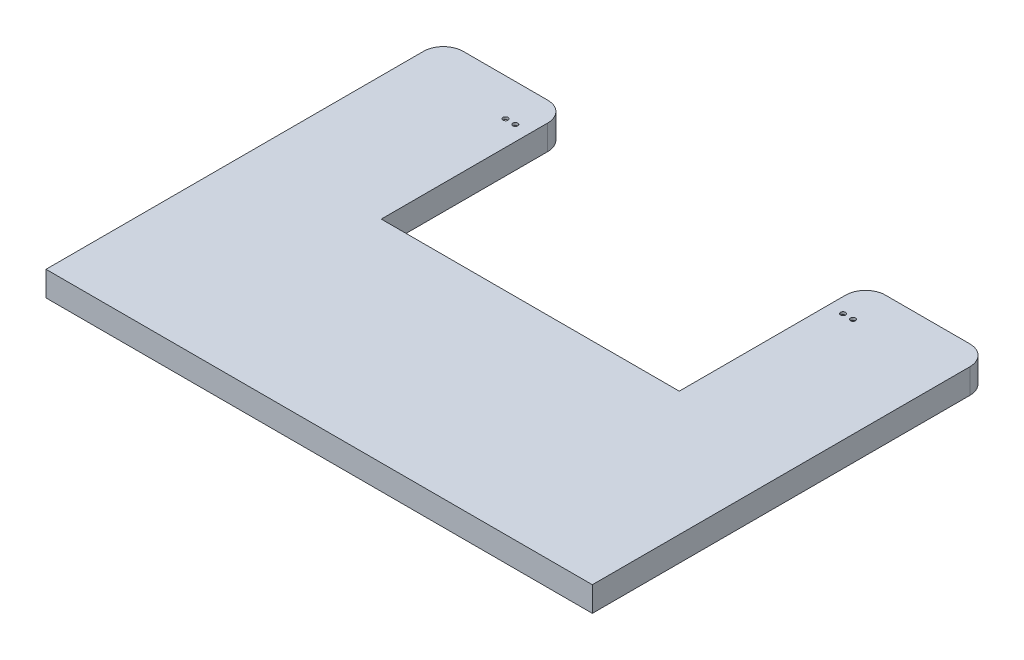
ISO-10303-21;
HEADER;
FILE_DESCRIPTION(('STEP AP214'),'2;1');
FILE_NAME('part.step','',(''),(''),'','','');
FILE_SCHEMA(('AUTOMOTIVE_DESIGN { 1 0 10303 214 1 1 1 1 }'));
ENDSEC;
DATA;
#1=APPLICATION_CONTEXT('core data for automotive mechanical design processes');
#2=APPLICATION_PROTOCOL_DEFINITION('international standard','automotive_design',2000,#1);
#3=PRODUCT_CONTEXT('',#1,'mechanical');
#4=PRODUCT('Part','Part','',(#3));
#5=PRODUCT_RELATED_PRODUCT_CATEGORY('part','',(#4));
#6=PRODUCT_DEFINITION_FORMATION('','',#4);
#7=PRODUCT_DEFINITION_CONTEXT('part definition',#1,'design');
#8=PRODUCT_DEFINITION('design','',#6,#7);
#9=PRODUCT_DEFINITION_SHAPE('','',#8);
#10=(LENGTH_UNIT() NAMED_UNIT(*) SI_UNIT(.MILLI.,.METRE.));
#11=(NAMED_UNIT(*) PLANE_ANGLE_UNIT() SI_UNIT($,.RADIAN.));
#12=(NAMED_UNIT(*) SI_UNIT($,.STERADIAN.) SOLID_ANGLE_UNIT());
#13=UNCERTAINTY_MEASURE_WITH_UNIT(LENGTH_MEASURE(1.E-05),#10,'distance_accuracy_value','');
#14=(GEOMETRIC_REPRESENTATION_CONTEXT(3) GLOBAL_UNCERTAINTY_ASSIGNED_CONTEXT((#13)) GLOBAL_UNIT_ASSIGNED_CONTEXT((#10,
#11,#12)) REPRESENTATION_CONTEXT('',''));
#15=CARTESIAN_POINT('',(0.,0.,0.));
#16=DIRECTION('',(0.,0.,1.));
#17=DIRECTION('',(1.,0.,0.));
#18=AXIS2_PLACEMENT_3D('',#15,#16,#17);
#19=CARTESIAN_POINT('',(0.,25.4,-203.2));
#20=DIRECTION('',(0.,0.,-1.));
#21=DIRECTION('',(-1.,0.,0.));
#22=AXIS2_PLACEMENT_3D('',#19,#20,#21);
#23=PLANE('',#22);
#24=DIRECTION('',(1.,0.,0.));
#25=VECTOR('',#24,1.);
#26=CARTESIAN_POINT('',(0.,25.4,-203.2));
#27=LINE('',#26,#25);
#28=CARTESIAN_POINT('',(172.72,25.4,-203.2));
#29=VERTEX_POINT('',#28);
#30=CARTESIAN_POINT('',(259.08,25.4,-203.2));
#31=VERTEX_POINT('',#30);
#32=EDGE_CURVE('E305',#29,#31,#27,.T.);
#33=ORIENTED_EDGE('',*,*,#32,.T.);
#34=DIRECTION('',(0.,-1.,0.));
#35=VECTOR('',#34,1.);
#36=CARTESIAN_POINT('',(259.08,0.,-203.2));
#37=LINE('',#36,#35);
#38=CARTESIAN_POINT('',(259.08,0.,-203.2));
#39=VERTEX_POINT('',#38);
#40=EDGE_CURVE('E349',#31,#39,#37,.T.);
#41=ORIENTED_EDGE('',*,*,#40,.T.);
#42=DIRECTION('',(1.,0.,0.));
#43=VECTOR('',#42,1.);
#44=CARTESIAN_POINT('',(0.,0.,-203.2));
#45=LINE('',#44,#43);
#46=CARTESIAN_POINT('',(172.72,0.,-203.2));
#47=VERTEX_POINT('',#46);
#48=EDGE_CURVE('E264',#47,#39,#45,.T.);
#49=ORIENTED_EDGE('',*,*,#48,.F.);
#50=DIRECTION('',(0.,-1.,0.));
#51=VECTOR('',#50,1.);
#52=CARTESIAN_POINT('',(172.72,25.4,-203.2));
#53=LINE('',#52,#51);
#54=EDGE_CURVE('E347',#47,#29,#53,.F.);
#55=ORIENTED_EDGE('',*,*,#54,.T.);
#56=EDGE_LOOP('',(#33,#41,#49,#55));
#57=FACE_BOUND('',#56,.T.);
#58=ADVANCED_FACE('F40',(#57),#23,.T.);
#59=CARTESIAN_POINT('',(152.4,25.4,0.));
#60=DIRECTION('',(1.,0.,0.));
#61=DIRECTION('',(0.,0.,-1.));
#62=AXIS2_PLACEMENT_3D('',#59,#60,#61);
#63=PLANE('',#62);
#64=DIRECTION('',(0.,0.,1.));
#65=VECTOR('',#64,1.);
#66=CARTESIAN_POINT('',(152.4,25.4,0.));
#67=LINE('',#66,#65);
#68=CARTESIAN_POINT('',(152.4,25.4,-182.88));
#69=VERTEX_POINT('',#68);
#70=CARTESIAN_POINT('',(152.4,25.4,-12.7));
#71=VERTEX_POINT('',#70);
#72=EDGE_CURVE('E306',#69,#71,#67,.T.);
#73=ORIENTED_EDGE('',*,*,#72,.F.);
#74=DIRECTION('',(0.,-1.,0.));
#75=VECTOR('',#74,1.);
#76=CARTESIAN_POINT('',(152.4,0.,-182.88));
#77=LINE('',#76,#75);
#78=CARTESIAN_POINT('',(152.4,0.,-182.88));
#79=VERTEX_POINT('',#78);
#80=EDGE_CURVE('E369',#69,#79,#77,.T.);
#81=ORIENTED_EDGE('',*,*,#80,.T.);
#82=DIRECTION('',(0.,0.,1.));
#83=VECTOR('',#82,1.);
#84=CARTESIAN_POINT('',(152.4,0.,0.));
#85=LINE('',#84,#83);
#86=CARTESIAN_POINT('',(152.4,0.,-12.7));
#87=VERTEX_POINT('',#86);
#88=EDGE_CURVE('E324',#79,#87,#85,.T.);
#89=ORIENTED_EDGE('',*,*,#88,.T.);
#90=DIRECTION('',(0.,-1.,0.));
#91=VECTOR('',#90,1.);
#92=CARTESIAN_POINT('',(152.4,25.4,-12.7));
#93=LINE('',#92,#91);
#94=EDGE_CURVE('E344',#71,#87,#93,.T.);
#95=ORIENTED_EDGE('',*,*,#94,.F.);
#96=EDGE_LOOP('',(#73,#81,#89,#95));
#97=FACE_BOUND('',#96,.T.);
#98=ADVANCED_FACE('F406',(#97),#63,.F.);
#99=CARTESIAN_POINT('',(0.,25.4,-12.7));
#100=DIRECTION('',(0.,0.,-1.));
#101=DIRECTION('',(-1.,0.,0.));
#102=AXIS2_PLACEMENT_3D('',#99,#100,#101);
#103=PLANE('',#102);
#104=DIRECTION('',(1.,0.,0.));
#105=VECTOR('',#104,1.);
#106=CARTESIAN_POINT('',(0.,0.,-12.7));
#107=LINE('',#106,#105);
#108=CARTESIAN_POINT('',(-152.4,0.,-12.7));
#109=VERTEX_POINT('',#108);
#110=EDGE_CURVE('E326',#109,#87,#107,.T.);
#111=ORIENTED_EDGE('',*,*,#110,.F.);
#112=DIRECTION('',(0.,-1.,0.));
#113=VECTOR('',#112,1.);
#114=CARTESIAN_POINT('',(-152.4,25.4,-12.7));
#115=LINE('',#114,#113);
#116=CARTESIAN_POINT('',(-152.4,25.4,-12.7));
#117=VERTEX_POINT('',#116);
#118=EDGE_CURVE('E341',#117,#109,#115,.T.);
#119=ORIENTED_EDGE('',*,*,#118,.F.);
#120=DIRECTION('',(1.,0.,0.));
#121=VECTOR('',#120,1.);
#122=CARTESIAN_POINT('',(0.,25.4,-12.7));
#123=LINE('',#122,#121);
#124=EDGE_CURVE('E308',#117,#71,#123,.T.);
#125=ORIENTED_EDGE('',*,*,#124,.T.);
#126=ORIENTED_EDGE('',*,*,#94,.T.);
#127=EDGE_LOOP('',(#111,#119,#125,#126));
#128=FACE_BOUND('',#127,.T.);
#129=ADVANCED_FACE('F413',(#128),#103,.T.);
#130=CARTESIAN_POINT('',(-152.4,25.4,0.));
#131=DIRECTION('',(1.,0.,0.));
#132=DIRECTION('',(0.,0.,-1.));
#133=AXIS2_PLACEMENT_3D('',#130,#131,#132);
#134=PLANE('',#133);
#135=DIRECTION('',(0.,0.,1.));
#136=VECTOR('',#135,1.);
#137=CARTESIAN_POINT('',(-152.4,0.,0.));
#138=LINE('',#137,#136);
#139=CARTESIAN_POINT('',(-152.4,0.,-182.88));
#140=VERTEX_POINT('',#139);
#141=EDGE_CURVE('E323',#140,#109,#138,.T.);
#142=ORIENTED_EDGE('',*,*,#141,.F.);
#143=DIRECTION('',(0.,-1.,0.));
#144=VECTOR('',#143,1.);
#145=CARTESIAN_POINT('',(-152.4,25.4,-182.88));
#146=LINE('',#145,#144);
#147=CARTESIAN_POINT('',(-152.4,25.4,-182.88));
#148=VERTEX_POINT('',#147);
#149=EDGE_CURVE('E11',#140,#148,#146,.F.);
#150=ORIENTED_EDGE('',*,*,#149,.T.);
#151=DIRECTION('',(0.,0.,1.));
#152=VECTOR('',#151,1.);
#153=CARTESIAN_POINT('',(-152.4,25.4,0.));
#154=LINE('',#153,#152);
#155=EDGE_CURVE('E304',#148,#117,#154,.T.);
#156=ORIENTED_EDGE('',*,*,#155,.T.);
#157=ORIENTED_EDGE('',*,*,#118,.T.);
#158=EDGE_LOOP('',(#142,#150,#156,#157));
#159=FACE_BOUND('',#158,.T.);
#160=ADVANCED_FACE('F421',(#159),#134,.T.);
#161=CARTESIAN_POINT('',(-259.08,0.,-203.2));
#162=VERTEX_POINT('',#161);
#163=CARTESIAN_POINT('',(-172.72,0.,-203.2));
#164=VERTEX_POINT('',#163);
#165=EDGE_CURVE('E319',#162,#164,#45,.T.);
#166=ORIENTED_EDGE('',*,*,#165,.F.);
#167=DIRECTION('',(0.,-1.,0.));
#168=VECTOR('',#167,1.);
#169=CARTESIAN_POINT('',(-259.08,25.4,-203.2));
#170=LINE('',#169,#168);
#171=CARTESIAN_POINT('',(-259.08,25.4,-203.2));
#172=VERTEX_POINT('',#171);
#173=EDGE_CURVE('E49',#162,#172,#170,.F.);
#174=ORIENTED_EDGE('',*,*,#173,.T.);
#175=CARTESIAN_POINT('',(-172.72,25.4,-203.2));
#176=VERTEX_POINT('',#175);
#177=EDGE_CURVE('E300',#172,#176,#27,.T.);
#178=ORIENTED_EDGE('',*,*,#177,.T.);
#179=DIRECTION('',(0.,-1.,0.));
#180=VECTOR('',#179,1.);
#181=CARTESIAN_POINT('',(-172.72,25.4,-203.2));
#182=LINE('',#181,#180);
#183=EDGE_CURVE('E375',#176,#164,#182,.T.);
#184=ORIENTED_EDGE('',*,*,#183,.T.);
#185=EDGE_LOOP('',(#166,#174,#178,#184));
#186=FACE_BOUND('',#185,.T.);
#187=ADVANCED_FACE('F409',(#186),#23,.T.);
#188=CARTESIAN_POINT('',(-279.4,25.4,0.));
#189=DIRECTION('',(-1.,0.,0.));
#190=DIRECTION('',(0.,0.,1.));
#191=AXIS2_PLACEMENT_3D('',#188,#189,#190);
#192=PLANE('',#191);
#193=DIRECTION('',(0.,0.,-1.));
#194=VECTOR('',#193,1.);
#195=CARTESIAN_POINT('',(-279.4,25.4,0.));
#196=LINE('',#195,#194);
#197=CARTESIAN_POINT('',(-279.4,25.4,203.2));
#198=VERTEX_POINT('',#197);
#199=CARTESIAN_POINT('',(-279.4,25.4,-182.88));
#200=VERTEX_POINT('',#199);
#201=EDGE_CURVE('E303',#198,#200,#196,.T.);
#202=ORIENTED_EDGE('',*,*,#201,.T.);
#203=DIRECTION('',(0.,-1.,0.));
#204=VECTOR('',#203,1.);
#205=CARTESIAN_POINT('',(-279.4,25.4,-182.88));
#206=LINE('',#205,#204);
#207=CARTESIAN_POINT('',(-279.4,0.,-182.88));
#208=VERTEX_POINT('',#207);
#209=EDGE_CURVE('E372',#200,#208,#206,.T.);
#210=ORIENTED_EDGE('',*,*,#209,.T.);
#211=DIRECTION('',(0.,0.,-1.));
#212=VECTOR('',#211,1.);
#213=CARTESIAN_POINT('',(-279.4,0.,0.));
#214=LINE('',#213,#212);
#215=CARTESIAN_POINT('',(-279.4,0.,203.2));
#216=VERTEX_POINT('',#215);
#217=EDGE_CURVE('E322',#216,#208,#214,.T.);
#218=ORIENTED_EDGE('',*,*,#217,.F.);
#219=DIRECTION('',(0.,-1.,0.));
#220=VECTOR('',#219,1.);
#221=CARTESIAN_POINT('',(-279.4,25.4,203.2));
#222=LINE('',#221,#220);
#223=EDGE_CURVE('E339',#198,#216,#222,.T.);
#224=ORIENTED_EDGE('',*,*,#223,.F.);
#225=EDGE_LOOP('',(#202,#210,#218,#224));
#226=FACE_BOUND('',#225,.T.);
#227=ADVANCED_FACE('F420',(#226),#192,.T.);
#228=CARTESIAN_POINT('',(0.,25.4,203.2));
#229=DIRECTION('',(0.,0.,-1.));
#230=DIRECTION('',(-1.,0.,0.));
#231=AXIS2_PLACEMENT_3D('',#228,#229,#230);
#232=PLANE('',#231);
#233=DIRECTION('',(1.,0.,0.));
#234=VECTOR('',#233,1.);
#235=CARTESIAN_POINT('',(0.,0.,203.2));
#236=LINE('',#235,#234);
#237=CARTESIAN_POINT('',(279.4,0.,203.2));
#238=VERTEX_POINT('',#237);
#239=EDGE_CURVE('E332',#216,#238,#236,.T.);
#240=ORIENTED_EDGE('',*,*,#239,.T.);
#241=DIRECTION('',(0.,-1.,0.));
#242=VECTOR('',#241,1.);
#243=CARTESIAN_POINT('',(279.4,25.4,203.2));
#244=LINE('',#243,#242);
#245=CARTESIAN_POINT('',(279.4,25.4,203.2));
#246=VERTEX_POINT('',#245);
#247=EDGE_CURVE('E318',#246,#238,#244,.T.);
#248=ORIENTED_EDGE('',*,*,#247,.F.);
#249=DIRECTION('',(1.,0.,0.));
#250=VECTOR('',#249,1.);
#251=CARTESIAN_POINT('',(0.,25.4,203.2));
#252=LINE('',#251,#250);
#253=EDGE_CURVE('E313',#198,#246,#252,.T.);
#254=ORIENTED_EDGE('',*,*,#253,.F.);
#255=ORIENTED_EDGE('',*,*,#223,.T.);
#256=EDGE_LOOP('',(#240,#248,#254,#255));
#257=FACE_BOUND('',#256,.T.);
#258=ADVANCED_FACE('F427',(#257),#232,.F.);
#259=CARTESIAN_POINT('',(279.4,25.4,0.));
#260=DIRECTION('',(-1.,0.,0.));
#261=DIRECTION('',(0.,0.,1.));
#262=AXIS2_PLACEMENT_3D('',#259,#260,#261);
#263=PLANE('',#262);
#264=DIRECTION('',(0.,0.,-1.));
#265=VECTOR('',#264,1.);
#266=CARTESIAN_POINT('',(279.4,0.,0.));
#267=LINE('',#266,#265);
#268=CARTESIAN_POINT('',(279.4,0.,-182.88));
#269=VERTEX_POINT('',#268);
#270=EDGE_CURVE('E334',#238,#269,#267,.T.);
#271=ORIENTED_EDGE('',*,*,#270,.T.);
#272=DIRECTION('',(0.,-1.,0.));
#273=VECTOR('',#272,1.);
#274=CARTESIAN_POINT('',(279.4,25.4,-182.88));
#275=LINE('',#274,#273);
#276=CARTESIAN_POINT('',(279.4,25.4,-182.88));
#277=VERTEX_POINT('',#276);
#278=EDGE_CURVE('E360',#269,#277,#275,.F.);
#279=ORIENTED_EDGE('',*,*,#278,.T.);
#280=DIRECTION('',(0.,0.,-1.));
#281=VECTOR('',#280,1.);
#282=CARTESIAN_POINT('',(279.4,25.4,0.));
#283=LINE('',#282,#281);
#284=EDGE_CURVE('E315',#246,#277,#283,.T.);
#285=ORIENTED_EDGE('',*,*,#284,.F.);
#286=ORIENTED_EDGE('',*,*,#247,.T.);
#287=EDGE_LOOP('',(#271,#279,#285,#286));
#288=FACE_BOUND('',#287,.T.);
#289=ADVANCED_FACE('F447',(#288),#263,.F.);
#290=CARTESIAN_POINT('',(0.,25.4,0.));
#291=DIRECTION('',(0.,1.,0.));
#292=DIRECTION('',(0.,0.,1.));
#293=AXIS2_PLACEMENT_3D('',#290,#291,#292);
#294=PLANE('',#293);
#295=CARTESIAN_POINT('',(-177.72,25.4,-165.1));
#296=DIRECTION('',(0.,1.,0.));
#297=DIRECTION('',(0.,0.,1.));
#298=AXIS2_PLACEMENT_3D('',#295,#296,#297);
#299=CIRCLE('',#298,2.53999999999998);
#300=CARTESIAN_POINT('',(-177.72,25.4,-162.56));
#301=VERTEX_POINT('',#300);
#302=EDGE_CURVE('E383',#301,#301,#299,.T.);
#303=ORIENTED_EDGE('',*,*,#302,.F.);
#304=EDGE_LOOP('',(#303));
#305=FACE_BOUND('',#304,.T.);
#306=CARTESIAN_POINT('',(-167.56,25.4,-165.1));
#307=DIRECTION('',(0.,1.,0.));
#308=DIRECTION('',(0.,0.,1.));
#309=AXIS2_PLACEMENT_3D('',#306,#307,#308);
#310=CIRCLE('',#309,2.53999999999998);
#311=CARTESIAN_POINT('',(-167.56,25.4,-162.56));
#312=VERTEX_POINT('',#311);
#313=EDGE_CURVE('E732',#312,#312,#310,.T.);
#314=ORIENTED_EDGE('',*,*,#313,.F.);
#315=EDGE_LOOP('',(#314));
#316=FACE_BOUND('',#315,.T.);
#317=CARTESIAN_POINT('',(167.56,25.4,-165.1));
#318=DIRECTION('',(0.,1.,0.));
#319=DIRECTION('',(0.,0.,1.));
#320=AXIS2_PLACEMENT_3D('',#317,#318,#319);
#321=CIRCLE('',#320,2.54000000000001);
#322=CARTESIAN_POINT('',(167.56,25.4,-162.56));
#323=VERTEX_POINT('',#322);
#324=EDGE_CURVE('E725',#323,#323,#321,.T.);
#325=ORIENTED_EDGE('',*,*,#324,.F.);
#326=EDGE_LOOP('',(#325));
#327=FACE_BOUND('',#326,.T.);
#328=CARTESIAN_POINT('',(177.72,25.4,-165.1));
#329=DIRECTION('',(0.,1.,0.));
#330=DIRECTION('',(0.,0.,1.));
#331=AXIS2_PLACEMENT_3D('',#328,#329,#330);
#332=CIRCLE('',#331,2.54000000000001);
#333=CARTESIAN_POINT('',(177.72,25.4,-162.56));
#334=VERTEX_POINT('',#333);
#335=EDGE_CURVE('E733',#334,#334,#332,.T.);
#336=ORIENTED_EDGE('',*,*,#335,.F.);
#337=EDGE_LOOP('',(#336));
#338=FACE_BOUND('',#337,.T.);
#339=ORIENTED_EDGE('',*,*,#284,.T.);
#340=CARTESIAN_POINT('',(259.08,25.4,-182.88));
#341=DIRECTION('',(0.,1.,0.));
#342=DIRECTION('',(0.,0.,1.));
#343=AXIS2_PLACEMENT_3D('',#340,#341,#342);
#344=CIRCLE('',#343,20.32);
#345=EDGE_CURVE('E367',#277,#31,#344,.T.);
#346=ORIENTED_EDGE('',*,*,#345,.T.);
#347=ORIENTED_EDGE('',*,*,#32,.F.);
#348=CARTESIAN_POINT('',(172.72,25.4,-182.88));
#349=DIRECTION('',(0.,1.,0.));
#350=DIRECTION('',(0.,0.,1.));
#351=AXIS2_PLACEMENT_3D('',#348,#349,#350);
#352=CIRCLE('',#351,20.32);
#353=EDGE_CURVE('E365',#29,#69,#352,.T.);
#354=ORIENTED_EDGE('',*,*,#353,.T.);
#355=ORIENTED_EDGE('',*,*,#72,.T.);
#356=ORIENTED_EDGE('',*,*,#124,.F.);
#357=ORIENTED_EDGE('',*,*,#155,.F.);
#358=CARTESIAN_POINT('',(-172.72,25.4,-182.88));
#359=DIRECTION('',(0.,1.,0.));
#360=DIRECTION('',(0.,0.,1.));
#361=AXIS2_PLACEMENT_3D('',#358,#359,#360);
#362=CIRCLE('',#361,20.32);
#363=EDGE_CURVE('E362',#148,#176,#362,.T.);
#364=ORIENTED_EDGE('',*,*,#363,.T.);
#365=ORIENTED_EDGE('',*,*,#177,.F.);
#366=CARTESIAN_POINT('',(-259.08,25.4,-182.88));
#367=DIRECTION('',(0.,1.,0.));
#368=DIRECTION('',(0.,0.,1.));
#369=AXIS2_PLACEMENT_3D('',#366,#367,#368);
#370=CIRCLE('',#369,20.32);
#371=EDGE_CURVE('E65',#172,#200,#370,.T.);
#372=ORIENTED_EDGE('',*,*,#371,.T.);
#373=ORIENTED_EDGE('',*,*,#201,.F.);
#374=ORIENTED_EDGE('',*,*,#253,.T.);
#375=EDGE_LOOP('',(#339,#346,#347,#354,#355,#356,#357,#364,#365,#372,#373,#374));
#376=FACE_BOUND('',#375,.T.);
#377=ADVANCED_FACE('F450',(#305,#316,#327,#338,#376),#294,.T.);
#378=CARTESIAN_POINT('',(0.,0.,0.));
#379=DIRECTION('',(0.,1.,0.));
#380=DIRECTION('',(0.,0.,1.));
#381=AXIS2_PLACEMENT_3D('',#378,#379,#380);
#382=PLANE('',#381);
#383=DIRECTION('',(1.,0.,0.));
#384=VECTOR('',#383,1.);
#385=CARTESIAN_POINT('',(0.,0.,-200.66));
#386=LINE('',#385,#384);
#387=CARTESIAN_POINT('',(172.72,0.,-200.66));
#388=VERTEX_POINT('',#387);
#389=CARTESIAN_POINT('',(259.08,0.,-200.66));
#390=VERTEX_POINT('',#389);
#391=EDGE_CURVE('E275',#388,#390,#386,.T.);
#392=ORIENTED_EDGE('',*,*,#391,.F.);
#393=CARTESIAN_POINT('',(172.72,0.,-182.88));
#394=DIRECTION('',(0.,1.,0.));
#395=DIRECTION('',(0.,0.,1.));
#396=AXIS2_PLACEMENT_3D('',#393,#394,#395);
#397=CIRCLE('',#396,17.78);
#398=CARTESIAN_POINT('',(154.94,0.,-182.88));
#399=VERTEX_POINT('',#398);
#400=EDGE_CURVE('E211',#399,#388,#397,.F.);
#401=ORIENTED_EDGE('',*,*,#400,.F.);
#402=DIRECTION('',(0.,0.,1.));
#403=VECTOR('',#402,1.);
#404=CARTESIAN_POINT('',(154.94,0.,0.));
#405=LINE('',#404,#403);
#406=CARTESIAN_POINT('',(154.94,0.,-10.16));
#407=VERTEX_POINT('',#406);
#408=EDGE_CURVE('E57',#399,#407,#405,.T.);
#409=ORIENTED_EDGE('',*,*,#408,.T.);
#410=DIRECTION('',(1.,0.,0.));
#411=VECTOR('',#410,1.);
#412=CARTESIAN_POINT('',(0.,0.,-10.16));
#413=LINE('',#412,#411);
#414=CARTESIAN_POINT('',(-154.94,0.,-10.16));
#415=VERTEX_POINT('',#414);
#416=EDGE_CURVE('E295',#415,#407,#413,.T.);
#417=ORIENTED_EDGE('',*,*,#416,.F.);
#418=DIRECTION('',(0.,0.,1.));
#419=VECTOR('',#418,1.);
#420=CARTESIAN_POINT('',(-154.94,0.,0.));
#421=LINE('',#420,#419);
#422=CARTESIAN_POINT('',(-154.94,0.,-182.88));
#423=VERTEX_POINT('',#422);
#424=EDGE_CURVE('E292',#423,#415,#421,.T.);
#425=ORIENTED_EDGE('',*,*,#424,.F.);
#426=CARTESIAN_POINT('',(-172.72,0.,-182.88));
#427=DIRECTION('',(0.,1.,0.));
#428=DIRECTION('',(0.,0.,1.));
#429=AXIS2_PLACEMENT_3D('',#426,#427,#428);
#430=CIRCLE('',#429,17.78);
#431=CARTESIAN_POINT('',(-172.72,0.,-200.66));
#432=VERTEX_POINT('',#431);
#433=EDGE_CURVE('E289',#432,#423,#430,.F.);
#434=ORIENTED_EDGE('',*,*,#433,.F.);
#435=DIRECTION('',(1.,0.,0.));
#436=VECTOR('',#435,1.);
#437=CARTESIAN_POINT('',(0.,0.,-200.66));
#438=LINE('',#437,#436);
#439=CARTESIAN_POINT('',(-259.08,0.,-200.66));
#440=VERTEX_POINT('',#439);
#441=EDGE_CURVE('E286',#440,#432,#438,.T.);
#442=ORIENTED_EDGE('',*,*,#441,.F.);
#443=CARTESIAN_POINT('',(-259.08,0.,-182.88));
#444=DIRECTION('',(0.,1.,0.));
#445=DIRECTION('',(0.,0.,1.));
#446=AXIS2_PLACEMENT_3D('',#443,#444,#445);
#447=CIRCLE('',#446,17.78);
#448=CARTESIAN_POINT('',(-276.86,0.,-182.88));
#449=VERTEX_POINT('',#448);
#450=EDGE_CURVE('E287',#449,#440,#447,.F.);
#451=ORIENTED_EDGE('',*,*,#450,.F.);
#452=DIRECTION('',(0.,0.,-1.));
#453=VECTOR('',#452,1.);
#454=CARTESIAN_POINT('',(-276.86,0.,0.));
#455=LINE('',#454,#453);
#456=CARTESIAN_POINT('',(-276.86,0.,200.66));
#457=VERTEX_POINT('',#456);
#458=EDGE_CURVE('E283',#457,#449,#455,.T.);
#459=ORIENTED_EDGE('',*,*,#458,.F.);
#460=DIRECTION('',(1.,0.,0.));
#461=VECTOR('',#460,1.);
#462=CARTESIAN_POINT('',(0.,0.,200.66));
#463=LINE('',#462,#461);
#464=CARTESIAN_POINT('',(276.86,0.,200.66));
#465=VERTEX_POINT('',#464);
#466=EDGE_CURVE('E280',#457,#465,#463,.T.);
#467=ORIENTED_EDGE('',*,*,#466,.T.);
#468=DIRECTION('',(0.,0.,-1.));
#469=VECTOR('',#468,1.);
#470=CARTESIAN_POINT('',(276.86,0.,0.));
#471=LINE('',#470,#469);
#472=CARTESIAN_POINT('',(276.86,0.,-182.88));
#473=VERTEX_POINT('',#472);
#474=EDGE_CURVE('E225',#465,#473,#471,.T.);
#475=ORIENTED_EDGE('',*,*,#474,.T.);
#476=CARTESIAN_POINT('',(259.08,0.,-182.88));
#477=DIRECTION('',(0.,1.,0.));
#478=DIRECTION('',(0.,0.,1.));
#479=AXIS2_PLACEMENT_3D('',#476,#477,#478);
#480=CIRCLE('',#479,17.78);
#481=EDGE_CURVE('E274',#390,#473,#480,.F.);
#482=ORIENTED_EDGE('',*,*,#481,.F.);
#483=EDGE_LOOP('',(#392,#401,#409,#417,#425,#434,#442,#451,#459,#467,#475,#482));
#484=FACE_BOUND('',#483,.T.);
#485=ORIENTED_EDGE('',*,*,#48,.T.);
#486=CARTESIAN_POINT('',(259.08,0.,-182.88));
#487=DIRECTION('',(0.,1.,0.));
#488=DIRECTION('',(0.,0.,1.));
#489=AXIS2_PLACEMENT_3D('',#486,#487,#488);
#490=CIRCLE('',#489,20.32);
#491=EDGE_CURVE('E358',#39,#269,#490,.F.);
#492=ORIENTED_EDGE('',*,*,#491,.T.);
#493=ORIENTED_EDGE('',*,*,#270,.F.);
#494=ORIENTED_EDGE('',*,*,#239,.F.);
#495=ORIENTED_EDGE('',*,*,#217,.T.);
#496=CARTESIAN_POINT('',(-259.08,0.,-182.88));
#497=DIRECTION('',(0.,1.,0.));
#498=DIRECTION('',(0.,0.,1.));
#499=AXIS2_PLACEMENT_3D('',#496,#497,#498);
#500=CIRCLE('',#499,20.32);
#501=EDGE_CURVE('E354',#208,#162,#500,.F.);
#502=ORIENTED_EDGE('',*,*,#501,.T.);
#503=ORIENTED_EDGE('',*,*,#165,.T.);
#504=CARTESIAN_POINT('',(-172.72,0.,-182.88));
#505=DIRECTION('',(0.,1.,0.));
#506=DIRECTION('',(0.,0.,1.));
#507=AXIS2_PLACEMENT_3D('',#504,#505,#506);
#508=CIRCLE('',#507,20.32);
#509=EDGE_CURVE('E352',#164,#140,#508,.F.);
#510=ORIENTED_EDGE('',*,*,#509,.T.);
#511=ORIENTED_EDGE('',*,*,#141,.T.);
#512=ORIENTED_EDGE('',*,*,#110,.T.);
#513=ORIENTED_EDGE('',*,*,#88,.F.);
#514=CARTESIAN_POINT('',(172.72,0.,-182.88));
#515=DIRECTION('',(0.,1.,0.));
#516=DIRECTION('',(0.,0.,1.));
#517=AXIS2_PLACEMENT_3D('',#514,#515,#516);
#518=CIRCLE('',#517,20.32);
#519=EDGE_CURVE('E356',#79,#47,#518,.F.);
#520=ORIENTED_EDGE('',*,*,#519,.T.);
#521=EDGE_LOOP('',(#485,#492,#493,#494,#495,#502,#503,#510,#511,#512,#513,#520));
#522=FACE_BOUND('',#521,.T.);
#523=ADVANCED_FACE('F440',(#484,#522),#382,.F.);
#524=CARTESIAN_POINT('',(259.08,25.4,-182.88));
#525=DIRECTION('',(0.,1.,0.));
#526=DIRECTION('',(0.,0.,1.));
#527=AXIS2_PLACEMENT_3D('',#524,#525,#526);
#528=CYLINDRICAL_SURFACE('',#527,20.32);
#529=ORIENTED_EDGE('',*,*,#345,.F.);
#530=ORIENTED_EDGE('',*,*,#278,.F.);
#531=ORIENTED_EDGE('',*,*,#491,.F.);
#532=ORIENTED_EDGE('',*,*,#40,.F.);
#533=EDGE_LOOP('',(#529,#530,#531,#532));
#534=FACE_BOUND('',#533,.T.);
#535=ADVANCED_FACE('F454',(#534),#528,.T.);
#536=CARTESIAN_POINT('',(172.72,25.4,-182.88));
#537=DIRECTION('',(0.,1.,0.));
#538=DIRECTION('',(0.,0.,1.));
#539=AXIS2_PLACEMENT_3D('',#536,#537,#538);
#540=CYLINDRICAL_SURFACE('',#539,20.32);
#541=ORIENTED_EDGE('',*,*,#353,.F.);
#542=ORIENTED_EDGE('',*,*,#54,.F.);
#543=ORIENTED_EDGE('',*,*,#519,.F.);
#544=ORIENTED_EDGE('',*,*,#80,.F.);
#545=EDGE_LOOP('',(#541,#542,#543,#544));
#546=FACE_BOUND('',#545,.T.);
#547=ADVANCED_FACE('F461',(#546),#540,.T.);
#548=CARTESIAN_POINT('',(-259.08,25.4,-182.88));
#549=DIRECTION('',(0.,-1.,0.));
#550=DIRECTION('',(0.,0.,-1.));
#551=AXIS2_PLACEMENT_3D('',#548,#549,#550);
#552=CYLINDRICAL_SURFACE('',#551,20.32);
#553=ORIENTED_EDGE('',*,*,#371,.F.);
#554=ORIENTED_EDGE('',*,*,#173,.F.);
#555=ORIENTED_EDGE('',*,*,#501,.F.);
#556=ORIENTED_EDGE('',*,*,#209,.F.);
#557=EDGE_LOOP('',(#553,#554,#555,#556));
#558=FACE_BOUND('',#557,.T.);
#559=ADVANCED_FACE('F435',(#558),#552,.T.);
#560=CARTESIAN_POINT('',(-172.72,25.4,-182.88));
#561=DIRECTION('',(0.,-1.,0.));
#562=DIRECTION('',(0.,0.,-1.));
#563=AXIS2_PLACEMENT_3D('',#560,#561,#562);
#564=CYLINDRICAL_SURFACE('',#563,20.32);
#565=ORIENTED_EDGE('',*,*,#363,.F.);
#566=ORIENTED_EDGE('',*,*,#149,.F.);
#567=ORIENTED_EDGE('',*,*,#509,.F.);
#568=ORIENTED_EDGE('',*,*,#183,.F.);
#569=EDGE_LOOP('',(#565,#566,#567,#568));
#570=FACE_BOUND('',#569,.T.);
#571=ADVANCED_FACE('F42',(#570),#564,.T.);
#572=CARTESIAN_POINT('',(0.,25.4,-200.66));
#573=DIRECTION('',(0.,0.,-1.));
#574=DIRECTION('',(-1.,0.,0.));
#575=AXIS2_PLACEMENT_3D('',#572,#573,#574);
#576=PLANE('',#575);
#577=DIRECTION('',(1.,0.,0.));
#578=VECTOR('',#577,1.);
#579=CARTESIAN_POINT('',(0.,22.86,-200.66));
#580=LINE('',#579,#578);
#581=CARTESIAN_POINT('',(172.72,22.86,-200.66));
#582=VERTEX_POINT('',#581);
#583=CARTESIAN_POINT('',(259.08,22.86,-200.66));
#584=VERTEX_POINT('',#583);
#585=EDGE_CURVE('E220',#582,#584,#580,.T.);
#586=ORIENTED_EDGE('',*,*,#585,.F.);
#587=DIRECTION('',(0.,1.,0.));
#588=VECTOR('',#587,1.);
#589=CARTESIAN_POINT('',(172.72,25.4,-200.66));
#590=LINE('',#589,#588);
#591=EDGE_CURVE('E204',#388,#582,#590,.T.);
#592=ORIENTED_EDGE('',*,*,#591,.F.);
#593=ORIENTED_EDGE('',*,*,#391,.T.);
#594=DIRECTION('',(0.,1.,0.));
#595=VECTOR('',#594,1.);
#596=CARTESIAN_POINT('',(259.08,25.4,-200.66));
#597=LINE('',#596,#595);
#598=EDGE_CURVE('E215',#584,#390,#597,.F.);
#599=ORIENTED_EDGE('',*,*,#598,.F.);
#600=EDGE_LOOP('',(#586,#592,#593,#599));
#601=FACE_BOUND('',#600,.T.);
#602=ADVANCED_FACE('F221',(#601),#576,.F.);
#603=CARTESIAN_POINT('',(154.94,25.4,0.));
#604=DIRECTION('',(1.,0.,0.));
#605=DIRECTION('',(0.,0.,-1.));
#606=AXIS2_PLACEMENT_3D('',#603,#604,#605);
#607=PLANE('',#606);
#608=DIRECTION('',(0.,0.,1.));
#609=VECTOR('',#608,1.);
#610=CARTESIAN_POINT('',(154.94,22.86,0.));
#611=LINE('',#610,#609);
#612=CARTESIAN_POINT('',(154.94,22.86,-182.88));
#613=VERTEX_POINT('',#612);
#614=CARTESIAN_POINT('',(154.94,22.86,-10.16));
#615=VERTEX_POINT('',#614);
#616=EDGE_CURVE('E224',#613,#615,#611,.T.);
#617=ORIENTED_EDGE('',*,*,#616,.T.);
#618=DIRECTION('',(0.,-1.,0.));
#619=VECTOR('',#618,1.);
#620=CARTESIAN_POINT('',(154.94,25.4,-10.16));
#621=LINE('',#620,#619);
#622=EDGE_CURVE('E216',#615,#407,#621,.T.);
#623=ORIENTED_EDGE('',*,*,#622,.T.);
#624=ORIENTED_EDGE('',*,*,#408,.F.);
#625=DIRECTION('',(0.,1.,0.));
#626=VECTOR('',#625,1.);
#627=CARTESIAN_POINT('',(154.94,25.4,-182.88));
#628=LINE('',#627,#626);
#629=EDGE_CURVE('E233',#613,#399,#628,.F.);
#630=ORIENTED_EDGE('',*,*,#629,.F.);
#631=EDGE_LOOP('',(#617,#623,#624,#630));
#632=FACE_BOUND('',#631,.T.);
#633=ADVANCED_FACE('F478',(#632),#607,.T.);
#634=CARTESIAN_POINT('',(0.,25.4,-10.16));
#635=DIRECTION('',(0.,0.,-1.));
#636=DIRECTION('',(-1.,0.,0.));
#637=AXIS2_PLACEMENT_3D('',#634,#635,#636);
#638=PLANE('',#637);
#639=ORIENTED_EDGE('',*,*,#416,.T.);
#640=ORIENTED_EDGE('',*,*,#622,.F.);
#641=DIRECTION('',(1.,0.,0.));
#642=VECTOR('',#641,1.);
#643=CARTESIAN_POINT('',(0.,22.86,-10.16));
#644=LINE('',#643,#642);
#645=CARTESIAN_POINT('',(-154.94,22.86,-10.16));
#646=VERTEX_POINT('',#645);
#647=EDGE_CURVE('E240',#646,#615,#644,.T.);
#648=ORIENTED_EDGE('',*,*,#647,.F.);
#649=DIRECTION('',(0.,-1.,0.));
#650=VECTOR('',#649,1.);
#651=CARTESIAN_POINT('',(-154.94,25.4,-10.16));
#652=LINE('',#651,#650);
#653=EDGE_CURVE('E258',#646,#415,#652,.T.);
#654=ORIENTED_EDGE('',*,*,#653,.T.);
#655=EDGE_LOOP('',(#639,#640,#648,#654));
#656=FACE_BOUND('',#655,.T.);
#657=ADVANCED_FACE('F566',(#656),#638,.F.);
#658=CARTESIAN_POINT('',(-154.94,25.4,0.));
#659=DIRECTION('',(1.,0.,0.));
#660=DIRECTION('',(0.,0.,-1.));
#661=AXIS2_PLACEMENT_3D('',#658,#659,#660);
#662=PLANE('',#661);
#663=ORIENTED_EDGE('',*,*,#424,.T.);
#664=ORIENTED_EDGE('',*,*,#653,.F.);
#665=DIRECTION('',(0.,0.,1.));
#666=VECTOR('',#665,1.);
#667=CARTESIAN_POINT('',(-154.94,22.86,0.));
#668=LINE('',#667,#666);
#669=CARTESIAN_POINT('',(-154.94,22.86,-182.88));
#670=VERTEX_POINT('',#669);
#671=EDGE_CURVE('E242',#670,#646,#668,.T.);
#672=ORIENTED_EDGE('',*,*,#671,.F.);
#673=DIRECTION('',(0.,1.,0.));
#674=VECTOR('',#673,1.);
#675=CARTESIAN_POINT('',(-154.94,25.4,-182.88));
#676=LINE('',#675,#674);
#677=EDGE_CURVE('E262',#423,#670,#676,.T.);
#678=ORIENTED_EDGE('',*,*,#677,.F.);
#679=EDGE_LOOP('',(#663,#664,#672,#678));
#680=FACE_BOUND('',#679,.T.);
#681=ADVANCED_FACE('F575',(#680),#662,.F.);
#682=ORIENTED_EDGE('',*,*,#441,.T.);
#683=DIRECTION('',(0.,1.,0.));
#684=VECTOR('',#683,1.);
#685=CARTESIAN_POINT('',(-172.72,25.4,-200.66));
#686=LINE('',#685,#684);
#687=CARTESIAN_POINT('',(-172.72,22.86,-200.66));
#688=VERTEX_POINT('',#687);
#689=EDGE_CURVE('E266',#688,#432,#686,.F.);
#690=ORIENTED_EDGE('',*,*,#689,.F.);
#691=DIRECTION('',(1.,0.,0.));
#692=VECTOR('',#691,1.);
#693=CARTESIAN_POINT('',(0.,22.86,-200.66));
#694=LINE('',#693,#692);
#695=CARTESIAN_POINT('',(-259.08,22.86,-200.66));
#696=VERTEX_POINT('',#695);
#697=EDGE_CURVE('E244',#696,#688,#694,.T.);
#698=ORIENTED_EDGE('',*,*,#697,.F.);
#699=DIRECTION('',(0.,1.,0.));
#700=VECTOR('',#699,1.);
#701=CARTESIAN_POINT('',(-259.08,25.4,-200.66));
#702=LINE('',#701,#700);
#703=EDGE_CURVE('E265',#440,#696,#702,.T.);
#704=ORIENTED_EDGE('',*,*,#703,.F.);
#705=EDGE_LOOP('',(#682,#690,#698,#704));
#706=FACE_BOUND('',#705,.T.);
#707=ADVANCED_FACE('F480',(#706),#576,.F.);
#708=CARTESIAN_POINT('',(-276.86,25.4,0.));
#709=DIRECTION('',(-1.,0.,0.));
#710=DIRECTION('',(0.,0.,1.));
#711=AXIS2_PLACEMENT_3D('',#708,#709,#710);
#712=PLANE('',#711);
#713=DIRECTION('',(0.,0.,-1.));
#714=VECTOR('',#713,1.);
#715=CARTESIAN_POINT('',(-276.86,22.86,0.));
#716=LINE('',#715,#714);
#717=CARTESIAN_POINT('',(-276.86,22.86,200.66));
#718=VERTEX_POINT('',#717);
#719=CARTESIAN_POINT('',(-276.86,22.86,-182.88));
#720=VERTEX_POINT('',#719);
#721=EDGE_CURVE('E248',#718,#720,#716,.T.);
#722=ORIENTED_EDGE('',*,*,#721,.F.);
#723=DIRECTION('',(0.,-1.,0.));
#724=VECTOR('',#723,1.);
#725=CARTESIAN_POINT('',(-276.86,25.4,200.66));
#726=LINE('',#725,#724);
#727=EDGE_CURVE('E261',#718,#457,#726,.T.);
#728=ORIENTED_EDGE('',*,*,#727,.T.);
#729=ORIENTED_EDGE('',*,*,#458,.T.);
#730=DIRECTION('',(0.,1.,0.));
#731=VECTOR('',#730,1.);
#732=CARTESIAN_POINT('',(-276.86,25.4,-182.88));
#733=LINE('',#732,#731);
#734=EDGE_CURVE('E256',#720,#449,#733,.F.);
#735=ORIENTED_EDGE('',*,*,#734,.F.);
#736=EDGE_LOOP('',(#722,#728,#729,#735));
#737=FACE_BOUND('',#736,.T.);
#738=ADVANCED_FACE('F594',(#737),#712,.F.);
#739=CARTESIAN_POINT('',(0.,25.4,200.66));
#740=DIRECTION('',(0.,0.,-1.));
#741=DIRECTION('',(-1.,0.,0.));
#742=AXIS2_PLACEMENT_3D('',#739,#740,#741);
#743=PLANE('',#742);
#744=ORIENTED_EDGE('',*,*,#466,.F.);
#745=ORIENTED_EDGE('',*,*,#727,.F.);
#746=DIRECTION('',(1.,0.,0.));
#747=VECTOR('',#746,1.);
#748=CARTESIAN_POINT('',(0.,22.86,200.66));
#749=LINE('',#748,#747);
#750=CARTESIAN_POINT('',(276.86,22.86,200.66));
#751=VERTEX_POINT('',#750);
#752=EDGE_CURVE('E252',#718,#751,#749,.T.);
#753=ORIENTED_EDGE('',*,*,#752,.T.);
#754=DIRECTION('',(0.,-1.,0.));
#755=VECTOR('',#754,1.);
#756=CARTESIAN_POINT('',(276.86,25.4,200.66));
#757=LINE('',#756,#755);
#758=EDGE_CURVE('E271',#751,#465,#757,.T.);
#759=ORIENTED_EDGE('',*,*,#758,.T.);
#760=EDGE_LOOP('',(#744,#745,#753,#759));
#761=FACE_BOUND('',#760,.T.);
#762=ADVANCED_FACE('F603',(#761),#743,.T.);
#763=CARTESIAN_POINT('',(276.86,25.4,0.));
#764=DIRECTION('',(-1.,0.,0.));
#765=DIRECTION('',(0.,0.,1.));
#766=AXIS2_PLACEMENT_3D('',#763,#764,#765);
#767=PLANE('',#766);
#768=ORIENTED_EDGE('',*,*,#474,.F.);
#769=ORIENTED_EDGE('',*,*,#758,.F.);
#770=DIRECTION('',(0.,0.,-1.));
#771=VECTOR('',#770,1.);
#772=CARTESIAN_POINT('',(276.86,22.86,0.));
#773=LINE('',#772,#771);
#774=CARTESIAN_POINT('',(276.86,22.86,-182.88));
#775=VERTEX_POINT('',#774);
#776=EDGE_CURVE('E254',#751,#775,#773,.T.);
#777=ORIENTED_EDGE('',*,*,#776,.T.);
#778=DIRECTION('',(0.,1.,0.));
#779=VECTOR('',#778,1.);
#780=CARTESIAN_POINT('',(276.86,25.4,-182.88));
#781=LINE('',#780,#779);
#782=EDGE_CURVE('E246',#473,#775,#781,.T.);
#783=ORIENTED_EDGE('',*,*,#782,.F.);
#784=EDGE_LOOP('',(#768,#769,#777,#783));
#785=FACE_BOUND('',#784,.T.);
#786=ADVANCED_FACE('F613',(#785),#767,.T.);
#787=CARTESIAN_POINT('',(0.,22.86,0.));
#788=DIRECTION('',(0.,1.,0.));
#789=DIRECTION('',(0.,0.,1.));
#790=AXIS2_PLACEMENT_3D('',#787,#788,#789);
#791=PLANE('',#790);
#792=CARTESIAN_POINT('',(-177.72,22.86,-165.1));
#793=DIRECTION('',(0.,1.,0.));
#794=DIRECTION('',(0.,0.,1.));
#795=AXIS2_PLACEMENT_3D('',#792,#793,#794);
#796=CIRCLE('',#795,2.53999999999998);
#797=CARTESIAN_POINT('',(-177.72,22.86,-162.56));
#798=VERTEX_POINT('',#797);
#799=EDGE_CURVE('E44',#798,#798,#796,.T.);
#800=ORIENTED_EDGE('',*,*,#799,.T.);
#801=EDGE_LOOP('',(#800));
#802=FACE_BOUND('',#801,.T.);
#803=CARTESIAN_POINT('',(-167.56,22.86,-165.1));
#804=DIRECTION('',(0.,1.,0.));
#805=DIRECTION('',(0.,0.,1.));
#806=AXIS2_PLACEMENT_3D('',#803,#804,#805);
#807=CIRCLE('',#806,2.53999999999998);
#808=CARTESIAN_POINT('',(-167.56,22.86,-162.56));
#809=VERTEX_POINT('',#808);
#810=EDGE_CURVE('E385',#809,#809,#807,.T.);
#811=ORIENTED_EDGE('',*,*,#810,.T.);
#812=EDGE_LOOP('',(#811));
#813=FACE_BOUND('',#812,.T.);
#814=CARTESIAN_POINT('',(167.56,22.86,-165.1));
#815=DIRECTION('',(0.,1.,0.));
#816=DIRECTION('',(0.,0.,1.));
#817=AXIS2_PLACEMENT_3D('',#814,#815,#816);
#818=CIRCLE('',#817,2.54000000000001);
#819=CARTESIAN_POINT('',(167.56,22.86,-162.56));
#820=VERTEX_POINT('',#819);
#821=EDGE_CURVE('E382',#820,#820,#818,.T.);
#822=ORIENTED_EDGE('',*,*,#821,.T.);
#823=EDGE_LOOP('',(#822));
#824=FACE_BOUND('',#823,.T.);
#825=CARTESIAN_POINT('',(177.72,22.86,-165.1));
#826=DIRECTION('',(0.,1.,0.));
#827=DIRECTION('',(0.,0.,1.));
#828=AXIS2_PLACEMENT_3D('',#825,#826,#827);
#829=CIRCLE('',#828,2.54000000000001);
#830=CARTESIAN_POINT('',(177.72,22.86,-162.56));
#831=VERTEX_POINT('',#830);
#832=EDGE_CURVE('E379',#831,#831,#829,.T.);
#833=ORIENTED_EDGE('',*,*,#832,.T.);
#834=EDGE_LOOP('',(#833));
#835=FACE_BOUND('',#834,.T.);
#836=ORIENTED_EDGE('',*,*,#776,.F.);
#837=ORIENTED_EDGE('',*,*,#752,.F.);
#838=ORIENTED_EDGE('',*,*,#721,.T.);
#839=CARTESIAN_POINT('',(-259.08,22.86,-182.88));
#840=DIRECTION('',(0.,1.,0.));
#841=DIRECTION('',(0.,0.,1.));
#842=AXIS2_PLACEMENT_3D('',#839,#840,#841);
#843=CIRCLE('',#842,17.78);
#844=EDGE_CURVE('E231',#696,#720,#843,.T.);
#845=ORIENTED_EDGE('',*,*,#844,.F.);
#846=ORIENTED_EDGE('',*,*,#697,.T.);
#847=CARTESIAN_POINT('',(-172.72,22.86,-182.88));
#848=DIRECTION('',(0.,1.,0.));
#849=DIRECTION('',(0.,0.,1.));
#850=AXIS2_PLACEMENT_3D('',#847,#848,#849);
#851=CIRCLE('',#850,17.78);
#852=EDGE_CURVE('E235',#670,#688,#851,.T.);
#853=ORIENTED_EDGE('',*,*,#852,.F.);
#854=ORIENTED_EDGE('',*,*,#671,.T.);
#855=ORIENTED_EDGE('',*,*,#647,.T.);
#856=ORIENTED_EDGE('',*,*,#616,.F.);
#857=CARTESIAN_POINT('',(172.72,22.86,-182.88));
#858=DIRECTION('',(0.,1.,0.));
#859=DIRECTION('',(0.,0.,1.));
#860=AXIS2_PLACEMENT_3D('',#857,#858,#859);
#861=CIRCLE('',#860,17.78);
#862=EDGE_CURVE('E208',#582,#613,#861,.T.);
#863=ORIENTED_EDGE('',*,*,#862,.F.);
#864=ORIENTED_EDGE('',*,*,#585,.T.);
#865=CARTESIAN_POINT('',(259.08,22.86,-182.88));
#866=DIRECTION('',(0.,1.,0.));
#867=DIRECTION('',(0.,0.,1.));
#868=AXIS2_PLACEMENT_3D('',#865,#866,#867);
#869=CIRCLE('',#868,17.78);
#870=EDGE_CURVE('E230',#775,#584,#869,.T.);
#871=ORIENTED_EDGE('',*,*,#870,.F.);
#872=EDGE_LOOP('',(#836,#837,#838,#845,#846,#853,#854,#855,#856,#863,#864,#871));
#873=FACE_BOUND('',#872,.T.);
#874=ADVANCED_FACE('F228',(#802,#813,#824,#835,#873),#791,.F.);
#875=CARTESIAN_POINT('',(259.08,25.4,-182.88));
#876=DIRECTION('',(0.,1.,0.));
#877=DIRECTION('',(0.,0.,1.));
#878=AXIS2_PLACEMENT_3D('',#875,#876,#877);
#879=CYLINDRICAL_SURFACE('',#878,17.78);
#880=ORIENTED_EDGE('',*,*,#870,.T.);
#881=ORIENTED_EDGE('',*,*,#598,.T.);
#882=ORIENTED_EDGE('',*,*,#481,.T.);
#883=ORIENTED_EDGE('',*,*,#782,.T.);
#884=EDGE_LOOP('',(#880,#881,#882,#883));
#885=FACE_BOUND('',#884,.T.);
#886=ADVANCED_FACE('F630',(#885),#879,.F.);
#887=CARTESIAN_POINT('',(172.72,25.4,-182.88));
#888=DIRECTION('',(0.,1.,0.));
#889=DIRECTION('',(0.,0.,1.));
#890=AXIS2_PLACEMENT_3D('',#887,#888,#889);
#891=CYLINDRICAL_SURFACE('',#890,17.78);
#892=ORIENTED_EDGE('',*,*,#862,.T.);
#893=ORIENTED_EDGE('',*,*,#629,.T.);
#894=ORIENTED_EDGE('',*,*,#400,.T.);
#895=ORIENTED_EDGE('',*,*,#591,.T.);
#896=EDGE_LOOP('',(#892,#893,#894,#895));
#897=FACE_BOUND('',#896,.T.);
#898=ADVANCED_FACE('F206',(#897),#891,.F.);
#899=CARTESIAN_POINT('',(-259.08,25.4,-182.88));
#900=DIRECTION('',(0.,-1.,0.));
#901=DIRECTION('',(0.,0.,-1.));
#902=AXIS2_PLACEMENT_3D('',#899,#900,#901);
#903=CYLINDRICAL_SURFACE('',#902,17.78);
#904=ORIENTED_EDGE('',*,*,#844,.T.);
#905=ORIENTED_EDGE('',*,*,#734,.T.);
#906=ORIENTED_EDGE('',*,*,#450,.T.);
#907=ORIENTED_EDGE('',*,*,#703,.T.);
#908=EDGE_LOOP('',(#904,#905,#906,#907));
#909=FACE_BOUND('',#908,.T.);
#910=ADVANCED_FACE('F644',(#909),#903,.F.);
#911=CARTESIAN_POINT('',(-172.72,25.4,-182.88));
#912=DIRECTION('',(0.,-1.,0.));
#913=DIRECTION('',(0.,0.,-1.));
#914=AXIS2_PLACEMENT_3D('',#911,#912,#913);
#915=CYLINDRICAL_SURFACE('',#914,17.78);
#916=ORIENTED_EDGE('',*,*,#852,.T.);
#917=ORIENTED_EDGE('',*,*,#689,.T.);
#918=ORIENTED_EDGE('',*,*,#433,.T.);
#919=ORIENTED_EDGE('',*,*,#677,.T.);
#920=EDGE_LOOP('',(#916,#917,#918,#919));
#921=FACE_BOUND('',#920,.T.);
#922=ADVANCED_FACE('F653',(#921),#915,.F.);
#923=CARTESIAN_POINT('',(177.72,0.,-165.1));
#924=DIRECTION('',(0.,1.,0.));
#925=DIRECTION('',(0.,0.,1.));
#926=AXIS2_PLACEMENT_3D('',#923,#924,#925);
#927=CYLINDRICAL_SURFACE('',#926,2.54000000000001);
#928=ORIENTED_EDGE('',*,*,#335,.T.);
#929=EDGE_LOOP('',(#928));
#930=FACE_BOUND('',#929,.T.);
#931=ORIENTED_EDGE('',*,*,#832,.F.);
#932=EDGE_LOOP('',(#931));
#933=FACE_BOUND('',#932,.T.);
#934=ADVANCED_FACE('F663',(#930,#933),#927,.F.);
#935=CARTESIAN_POINT('',(167.56,0.,-165.1));
#936=DIRECTION('',(0.,1.,0.));
#937=DIRECTION('',(0.,0.,1.));
#938=AXIS2_PLACEMENT_3D('',#935,#936,#937);
#939=CYLINDRICAL_SURFACE('',#938,2.54000000000001);
#940=ORIENTED_EDGE('',*,*,#324,.T.);
#941=EDGE_LOOP('',(#940));
#942=FACE_BOUND('',#941,.T.);
#943=ORIENTED_EDGE('',*,*,#821,.F.);
#944=EDGE_LOOP('',(#943));
#945=FACE_BOUND('',#944,.T.);
#946=ADVANCED_FACE('F401',(#942,#945),#939,.F.);
#947=CARTESIAN_POINT('',(-167.56,0.,-165.1));
#948=DIRECTION('',(0.,1.,0.));
#949=DIRECTION('',(0.,0.,1.));
#950=AXIS2_PLACEMENT_3D('',#947,#948,#949);
#951=CYLINDRICAL_SURFACE('',#950,2.53999999999998);
#952=ORIENTED_EDGE('',*,*,#313,.T.);
#953=EDGE_LOOP('',(#952));
#954=FACE_BOUND('',#953,.T.);
#955=ORIENTED_EDGE('',*,*,#810,.F.);
#956=EDGE_LOOP('',(#955));
#957=FACE_BOUND('',#956,.T.);
#958=ADVANCED_FACE('F395',(#954,#957),#951,.F.);
#959=CARTESIAN_POINT('',(-177.72,0.,-165.1));
#960=DIRECTION('',(0.,1.,0.));
#961=DIRECTION('',(0.,0.,1.));
#962=AXIS2_PLACEMENT_3D('',#959,#960,#961);
#963=CYLINDRICAL_SURFACE('',#962,2.53999999999998);
#964=ORIENTED_EDGE('',*,*,#302,.T.);
#965=EDGE_LOOP('',(#964));
#966=FACE_BOUND('',#965,.T.);
#967=ORIENTED_EDGE('',*,*,#799,.F.);
#968=EDGE_LOOP('',(#967));
#969=FACE_BOUND('',#968,.T.);
#970=ADVANCED_FACE('F393',(#966,#969),#963,.F.);
#971=CLOSED_SHELL('',(#58,#98,#129,#160,#187,#227,#258,#289,#377,#523,#535,#547,#559,#571,#602,
#633,#657,#681,#707,#738,#762,#786,#874,#886,#898,#910,#922,#934,#946,#958,#970));
#972=MANIFOLD_SOLID_BREP('B2',#971);
#973=ADVANCED_BREP_SHAPE_REPRESENTATION('',(#18,#972),#14);
#974=SHAPE_DEFINITION_REPRESENTATION(#9,#973);
ENDSEC;
END-ISO-10303-21;
